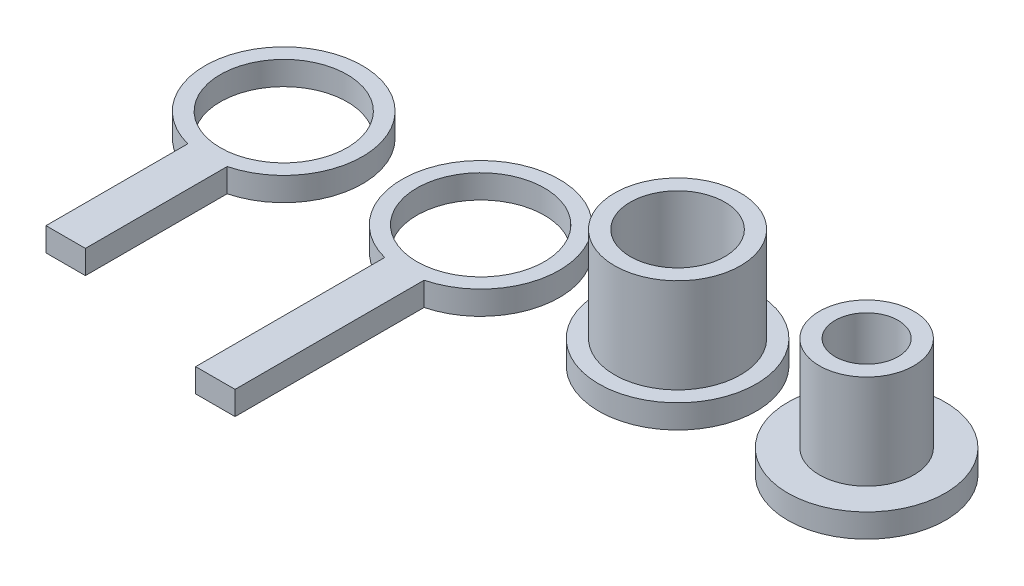
ISO-10303-21;
HEADER;
FILE_DESCRIPTION(('STEP AP214'),'2;1');
FILE_NAME('part.step','',(''),(''),'','','');
FILE_SCHEMA(('AUTOMOTIVE_DESIGN { 1 0 10303 214 1 1 1 1 }'));
ENDSEC;
DATA;
#1=APPLICATION_CONTEXT('core data for automotive mechanical design processes');
#2=APPLICATION_PROTOCOL_DEFINITION('international standard','automotive_design',2000,#1);
#3=PRODUCT_CONTEXT('',#1,'mechanical');
#4=PRODUCT('Part','Part','',(#3));
#5=PRODUCT_RELATED_PRODUCT_CATEGORY('part','',(#4));
#6=PRODUCT_DEFINITION_FORMATION('','',#4);
#7=PRODUCT_DEFINITION_CONTEXT('part definition',#1,'design');
#8=PRODUCT_DEFINITION('design','',#6,#7);
#9=PRODUCT_DEFINITION_SHAPE('','',#8);
#10=(LENGTH_UNIT() NAMED_UNIT(*) SI_UNIT(.MILLI.,.METRE.));
#11=(NAMED_UNIT(*) PLANE_ANGLE_UNIT() SI_UNIT($,.RADIAN.));
#12=(NAMED_UNIT(*) SI_UNIT($,.STERADIAN.) SOLID_ANGLE_UNIT());
#13=UNCERTAINTY_MEASURE_WITH_UNIT(LENGTH_MEASURE(1.E-05),#10,'distance_accuracy_value','');
#14=(GEOMETRIC_REPRESENTATION_CONTEXT(3) GLOBAL_UNCERTAINTY_ASSIGNED_CONTEXT((#13)) GLOBAL_UNIT_ASSIGNED_CONTEXT((#10,
#11,#12)) REPRESENTATION_CONTEXT('',''));
#15=CARTESIAN_POINT('',(0.,0.,0.));
#16=DIRECTION('',(0.,0.,1.));
#17=DIRECTION('',(1.,0.,0.));
#18=AXIS2_PLACEMENT_3D('',#15,#16,#17);
#19=CARTESIAN_POINT('',(-50.,3.,0.));
#20=DIRECTION('',(0.,1.,0.));
#21=DIRECTION('',(0.,0.,1.));
#22=AXIS2_PLACEMENT_3D('',#19,#20,#21);
#23=PLANE('',#22);
#24=CARTESIAN_POINT('',(-50.,3.,0.));
#25=DIRECTION('',(0.,1.,0.));
#26=DIRECTION('',(0.,0.,1.));
#27=AXIS2_PLACEMENT_3D('',#24,#25,#26);
#28=CIRCLE('',#27,10.);
#29=CARTESIAN_POINT('',(-47.5,3.,9.68245836551855));
#30=VERTEX_POINT('',#29);
#31=CARTESIAN_POINT('',(-52.5,3.,9.68245836551855));
#32=VERTEX_POINT('',#31);
#33=EDGE_CURVE('E116',#30,#32,#28,.T.);
#34=ORIENTED_EDGE('',*,*,#33,.T.);
#35=DIRECTION('',(0.,0.,1.));
#36=VECTOR('',#35,1.);
#37=CARTESIAN_POINT('',(-52.5,3.,27.6824583655185));
#38=LINE('',#37,#36);
#39=CARTESIAN_POINT('',(-52.5,3.,27.6824583655185));
#40=VERTEX_POINT('',#39);
#41=EDGE_CURVE('E85',#32,#40,#38,.T.);
#42=ORIENTED_EDGE('',*,*,#41,.T.);
#43=DIRECTION('',(1.,0.,0.));
#44=VECTOR('',#43,1.);
#45=CARTESIAN_POINT('',(-52.5,3.,27.6824583655185));
#46=LINE('',#45,#44);
#47=CARTESIAN_POINT('',(-47.5,3.,27.6824583655185));
#48=VERTEX_POINT('',#47);
#49=EDGE_CURVE('E124',#40,#48,#46,.T.);
#50=ORIENTED_EDGE('',*,*,#49,.T.);
#51=DIRECTION('',(0.,0.,-1.));
#52=VECTOR('',#51,1.);
#53=CARTESIAN_POINT('',(-47.5,3.,27.6824583655185));
#54=LINE('',#53,#52);
#55=EDGE_CURVE('E109',#48,#30,#54,.T.);
#56=ORIENTED_EDGE('',*,*,#55,.T.);
#57=EDGE_LOOP('',(#34,#42,#50,#56));
#58=FACE_BOUND('',#57,.T.);
#59=CARTESIAN_POINT('',(-50.,3.,0.));
#60=DIRECTION('',(0.,1.,0.));
#61=DIRECTION('',(0.,0.,1.));
#62=AXIS2_PLACEMENT_3D('',#59,#60,#61);
#63=CIRCLE('',#62,8.05);
#64=CARTESIAN_POINT('',(-50.,3.,8.05));
#65=VERTEX_POINT('',#64);
#66=EDGE_CURVE('E56',#65,#65,#63,.T.);
#67=ORIENTED_EDGE('',*,*,#66,.F.);
#68=EDGE_LOOP('',(#67));
#69=FACE_BOUND('',#68,.T.);
#70=ADVANCED_FACE('F52',(#58,#69),#23,.T.);
#71=CARTESIAN_POINT('',(-50.,0.,0.));
#72=DIRECTION('',(0.,1.,0.));
#73=DIRECTION('',(0.,0.,1.));
#74=AXIS2_PLACEMENT_3D('',#71,#72,#73);
#75=PLANE('',#74);
#76=CARTESIAN_POINT('',(-50.,0.,0.));
#77=DIRECTION('',(0.,1.,0.));
#78=DIRECTION('',(0.,0.,1.));
#79=AXIS2_PLACEMENT_3D('',#76,#77,#78);
#80=CIRCLE('',#79,10.);
#81=CARTESIAN_POINT('',(-47.5,0.,9.68245836551855));
#82=VERTEX_POINT('',#81);
#83=CARTESIAN_POINT('',(-52.5,0.,9.68245836551855));
#84=VERTEX_POINT('',#83);
#85=EDGE_CURVE('E115',#82,#84,#80,.T.);
#86=ORIENTED_EDGE('',*,*,#85,.F.);
#87=DIRECTION('',(0.,0.,-1.));
#88=VECTOR('',#87,1.);
#89=CARTESIAN_POINT('',(-47.5,0.,27.6824583655185));
#90=LINE('',#89,#88);
#91=CARTESIAN_POINT('',(-47.5,0.,27.6824583655185));
#92=VERTEX_POINT('',#91);
#93=EDGE_CURVE('E95',#92,#82,#90,.T.);
#94=ORIENTED_EDGE('',*,*,#93,.F.);
#95=DIRECTION('',(1.,0.,0.));
#96=VECTOR('',#95,1.);
#97=CARTESIAN_POINT('',(-52.5,0.,27.6824583655185));
#98=LINE('',#97,#96);
#99=CARTESIAN_POINT('',(-52.5,0.,27.6824583655185));
#100=VERTEX_POINT('',#99);
#101=EDGE_CURVE('E101',#100,#92,#98,.T.);
#102=ORIENTED_EDGE('',*,*,#101,.F.);
#103=DIRECTION('',(0.,0.,1.));
#104=VECTOR('',#103,1.);
#105=CARTESIAN_POINT('',(-52.5,0.,27.6824583655185));
#106=LINE('',#105,#104);
#107=EDGE_CURVE('E69',#84,#100,#106,.T.);
#108=ORIENTED_EDGE('',*,*,#107,.F.);
#109=EDGE_LOOP('',(#86,#94,#102,#108));
#110=FACE_BOUND('',#109,.T.);
#111=CARTESIAN_POINT('',(-50.,0.,0.));
#112=DIRECTION('',(0.,1.,0.));
#113=DIRECTION('',(0.,0.,1.));
#114=AXIS2_PLACEMENT_3D('',#111,#112,#113);
#115=CIRCLE('',#114,8.05);
#116=CARTESIAN_POINT('',(-50.,0.,8.05));
#117=VERTEX_POINT('',#116);
#118=EDGE_CURVE('E12',#117,#117,#115,.T.);
#119=ORIENTED_EDGE('',*,*,#118,.T.);
#120=EDGE_LOOP('',(#119));
#121=FACE_BOUND('',#120,.T.);
#122=ADVANCED_FACE('F112',(#110,#121),#75,.F.);
#123=CARTESIAN_POINT('',(-50.,3.,0.));
#124=DIRECTION('',(0.,-1.,0.));
#125=DIRECTION('',(0.,0.,-1.));
#126=AXIS2_PLACEMENT_3D('',#123,#124,#125);
#127=CYLINDRICAL_SURFACE('',#126,10.);
#128=ORIENTED_EDGE('',*,*,#85,.T.);
#129=DIRECTION('',(0.,-1.,0.));
#130=VECTOR('',#129,1.);
#131=CARTESIAN_POINT('',(-52.5,3.,9.68245836551855));
#132=LINE('',#131,#130);
#133=EDGE_CURVE('E131',#32,#84,#132,.T.);
#134=ORIENTED_EDGE('',*,*,#133,.F.);
#135=ORIENTED_EDGE('',*,*,#33,.F.);
#136=DIRECTION('',(0.,-1.,0.));
#137=VECTOR('',#136,1.);
#138=CARTESIAN_POINT('',(-47.5,3.,9.68245836551855));
#139=LINE('',#138,#137);
#140=EDGE_CURVE('E110',#30,#82,#139,.T.);
#141=ORIENTED_EDGE('',*,*,#140,.T.);
#142=EDGE_LOOP('',(#128,#134,#135,#141));
#143=FACE_BOUND('',#142,.T.);
#144=ADVANCED_FACE('F130',(#143),#127,.T.);
#145=CARTESIAN_POINT('',(-52.5,3.,27.6824583655185));
#146=DIRECTION('',(1.,0.,0.));
#147=DIRECTION('',(0.,0.,-1.));
#148=AXIS2_PLACEMENT_3D('',#145,#146,#147);
#149=PLANE('',#148);
#150=ORIENTED_EDGE('',*,*,#107,.T.);
#151=DIRECTION('',(0.,-1.,0.));
#152=VECTOR('',#151,1.);
#153=CARTESIAN_POINT('',(-52.5,3.,27.6824583655185));
#154=LINE('',#153,#152);
#155=EDGE_CURVE('E106',#40,#100,#154,.T.);
#156=ORIENTED_EDGE('',*,*,#155,.F.);
#157=ORIENTED_EDGE('',*,*,#41,.F.);
#158=ORIENTED_EDGE('',*,*,#133,.T.);
#159=EDGE_LOOP('',(#150,#156,#157,#158));
#160=FACE_BOUND('',#159,.T.);
#161=ADVANCED_FACE('F134',(#160),#149,.F.);
#162=CARTESIAN_POINT('',(-52.5,3.,27.6824583655185));
#163=DIRECTION('',(0.,0.,-1.));
#164=DIRECTION('',(-1.,0.,0.));
#165=AXIS2_PLACEMENT_3D('',#162,#163,#164);
#166=PLANE('',#165);
#167=ORIENTED_EDGE('',*,*,#101,.T.);
#168=DIRECTION('',(0.,-1.,0.));
#169=VECTOR('',#168,1.);
#170=CARTESIAN_POINT('',(-47.5,3.,27.6824583655185));
#171=LINE('',#170,#169);
#172=EDGE_CURVE('E104',#48,#92,#171,.T.);
#173=ORIENTED_EDGE('',*,*,#172,.F.);
#174=ORIENTED_EDGE('',*,*,#49,.F.);
#175=ORIENTED_EDGE('',*,*,#155,.T.);
#176=EDGE_LOOP('',(#167,#173,#174,#175));
#177=FACE_BOUND('',#176,.T.);
#178=ADVANCED_FACE('F102',(#177),#166,.F.);
#179=CARTESIAN_POINT('',(-47.5,3.,27.6824583655185));
#180=DIRECTION('',(-1.,0.,0.));
#181=DIRECTION('',(0.,0.,1.));
#182=AXIS2_PLACEMENT_3D('',#179,#180,#181);
#183=PLANE('',#182);
#184=ORIENTED_EDGE('',*,*,#93,.T.);
#185=ORIENTED_EDGE('',*,*,#140,.F.);
#186=ORIENTED_EDGE('',*,*,#55,.F.);
#187=ORIENTED_EDGE('',*,*,#172,.T.);
#188=EDGE_LOOP('',(#184,#185,#186,#187));
#189=FACE_BOUND('',#188,.T.);
#190=ADVANCED_FACE('F108',(#189),#183,.F.);
#191=CARTESIAN_POINT('',(-50.,3.,0.));
#192=DIRECTION('',(0.,-1.,0.));
#193=DIRECTION('',(0.,0.,-1.));
#194=AXIS2_PLACEMENT_3D('',#191,#192,#193);
#195=CYLINDRICAL_SURFACE('',#194,8.05);
#196=ORIENTED_EDGE('',*,*,#66,.T.);
#197=EDGE_LOOP('',(#196));
#198=FACE_BOUND('',#197,.T.);
#199=ORIENTED_EDGE('',*,*,#118,.F.);
#200=EDGE_LOOP('',(#199));
#201=FACE_BOUND('',#200,.T.);
#202=ADVANCED_FACE('F54',(#198,#201),#195,.F.);
#203=CLOSED_SHELL('',(#70,#122,#144,#161,#178,#190,#202));
#204=MANIFOLD_SOLID_BREP('B2',#203);
#205=CARTESIAN_POINT('',(-25.,3.,0.));
#206=DIRECTION('',(0.,1.,0.));
#207=DIRECTION('',(0.,0.,1.));
#208=AXIS2_PLACEMENT_3D('',#205,#206,#207);
#209=PLANE('',#208);
#210=CARTESIAN_POINT('',(-25.,3.,0.));
#211=DIRECTION('',(0.,1.,0.));
#212=DIRECTION('',(0.,0.,1.));
#213=AXIS2_PLACEMENT_3D('',#210,#211,#212);
#214=CIRCLE('',#213,10.);
#215=CARTESIAN_POINT('',(-22.5,3.,9.68245836551854));
#216=VERTEX_POINT('',#215);
#217=CARTESIAN_POINT('',(-27.5,3.,9.68245836551854));
#218=VERTEX_POINT('',#217);
#219=EDGE_CURVE('E257',#216,#218,#214,.T.);
#220=ORIENTED_EDGE('',*,*,#219,.T.);
#221=DIRECTION('',(0.,0.,1.));
#222=VECTOR('',#221,1.);
#223=CARTESIAN_POINT('',(-27.5,3.,33.6824583655185));
#224=LINE('',#223,#222);
#225=CARTESIAN_POINT('',(-27.5,3.,33.6824583655185));
#226=VERTEX_POINT('',#225);
#227=EDGE_CURVE('E252',#218,#226,#224,.T.);
#228=ORIENTED_EDGE('',*,*,#227,.T.);
#229=DIRECTION('',(1.,0.,0.));
#230=VECTOR('',#229,1.);
#231=CARTESIAN_POINT('',(-27.5,3.,33.6824583655185));
#232=LINE('',#231,#230);
#233=CARTESIAN_POINT('',(-22.5,3.,33.6824583655185));
#234=VERTEX_POINT('',#233);
#235=EDGE_CURVE('E255',#226,#234,#232,.T.);
#236=ORIENTED_EDGE('',*,*,#235,.T.);
#237=DIRECTION('',(0.,0.,-1.));
#238=VECTOR('',#237,1.);
#239=CARTESIAN_POINT('',(-22.5,3.,33.6824583655185));
#240=LINE('',#239,#238);
#241=EDGE_CURVE('E222',#234,#216,#240,.T.);
#242=ORIENTED_EDGE('',*,*,#241,.T.);
#243=EDGE_LOOP('',(#220,#228,#236,#242));
#244=FACE_BOUND('',#243,.T.);
#245=CARTESIAN_POINT('',(-25.,3.,0.));
#246=DIRECTION('',(0.,1.,0.));
#247=DIRECTION('',(0.,0.,1.));
#248=AXIS2_PLACEMENT_3D('',#245,#246,#247);
#249=CIRCLE('',#248,8.1);
#250=CARTESIAN_POINT('',(-25.,3.,8.1));
#251=VERTEX_POINT('',#250);
#252=EDGE_CURVE('E272',#251,#251,#249,.T.);
#253=ORIENTED_EDGE('',*,*,#252,.F.);
#254=EDGE_LOOP('',(#253));
#255=FACE_BOUND('',#254,.T.);
#256=ADVANCED_FACE('F205',(#244,#255),#209,.T.);
#257=CARTESIAN_POINT('',(-25.,0.,0.));
#258=DIRECTION('',(0.,1.,0.));
#259=DIRECTION('',(0.,0.,1.));
#260=AXIS2_PLACEMENT_3D('',#257,#258,#259);
#261=PLANE('',#260);
#262=CARTESIAN_POINT('',(-25.,0.,0.));
#263=DIRECTION('',(0.,1.,0.));
#264=DIRECTION('',(0.,0.,1.));
#265=AXIS2_PLACEMENT_3D('',#262,#263,#264);
#266=CIRCLE('',#265,10.);
#267=CARTESIAN_POINT('',(-22.5,0.,9.68245836551854));
#268=VERTEX_POINT('',#267);
#269=CARTESIAN_POINT('',(-27.5,0.,9.68245836551854));
#270=VERTEX_POINT('',#269);
#271=EDGE_CURVE('E269',#268,#270,#266,.T.);
#272=ORIENTED_EDGE('',*,*,#271,.F.);
#273=DIRECTION('',(0.,0.,-1.));
#274=VECTOR('',#273,1.);
#275=CARTESIAN_POINT('',(-22.5,0.,33.6824583655185));
#276=LINE('',#275,#274);
#277=CARTESIAN_POINT('',(-22.5,0.,33.6824583655185));
#278=VERTEX_POINT('',#277);
#279=EDGE_CURVE('E245',#278,#268,#276,.T.);
#280=ORIENTED_EDGE('',*,*,#279,.F.);
#281=DIRECTION('',(1.,0.,0.));
#282=VECTOR('',#281,1.);
#283=CARTESIAN_POINT('',(-27.5,0.,33.6824583655185));
#284=LINE('',#283,#282);
#285=CARTESIAN_POINT('',(-27.5,0.,33.6824583655185));
#286=VERTEX_POINT('',#285);
#287=EDGE_CURVE('E239',#286,#278,#284,.T.);
#288=ORIENTED_EDGE('',*,*,#287,.F.);
#289=DIRECTION('',(0.,0.,1.));
#290=VECTOR('',#289,1.);
#291=CARTESIAN_POINT('',(-27.5,0.,33.6824583655185));
#292=LINE('',#291,#290);
#293=EDGE_CURVE('E261',#270,#286,#292,.T.);
#294=ORIENTED_EDGE('',*,*,#293,.F.);
#295=EDGE_LOOP('',(#272,#280,#288,#294));
#296=FACE_BOUND('',#295,.T.);
#297=CARTESIAN_POINT('',(-25.,0.,0.));
#298=DIRECTION('',(0.,1.,0.));
#299=DIRECTION('',(0.,0.,1.));
#300=AXIS2_PLACEMENT_3D('',#297,#298,#299);
#301=CIRCLE('',#300,8.1);
#302=CARTESIAN_POINT('',(-25.,0.,8.1));
#303=VERTEX_POINT('',#302);
#304=EDGE_CURVE('E284',#303,#303,#301,.T.);
#305=ORIENTED_EDGE('',*,*,#304,.T.);
#306=EDGE_LOOP('',(#305));
#307=FACE_BOUND('',#306,.T.);
#308=ADVANCED_FACE('F280',(#296,#307),#261,.F.);
#309=CARTESIAN_POINT('',(-25.,3.,0.));
#310=DIRECTION('',(0.,-1.,0.));
#311=DIRECTION('',(0.,0.,-1.));
#312=AXIS2_PLACEMENT_3D('',#309,#310,#311);
#313=CYLINDRICAL_SURFACE('',#312,10.);
#314=ORIENTED_EDGE('',*,*,#271,.T.);
#315=DIRECTION('',(0.,-1.,0.));
#316=VECTOR('',#315,1.);
#317=CARTESIAN_POINT('',(-27.5,3.,9.68245836551854));
#318=LINE('',#317,#316);
#319=EDGE_CURVE('E50',#218,#270,#318,.T.);
#320=ORIENTED_EDGE('',*,*,#319,.F.);
#321=ORIENTED_EDGE('',*,*,#219,.F.);
#322=DIRECTION('',(0.,-1.,0.));
#323=VECTOR('',#322,1.);
#324=CARTESIAN_POINT('',(-22.5,3.,9.68245836551854));
#325=LINE('',#324,#323);
#326=EDGE_CURVE('E265',#216,#268,#325,.T.);
#327=ORIENTED_EDGE('',*,*,#326,.T.);
#328=EDGE_LOOP('',(#314,#320,#321,#327));
#329=FACE_BOUND('',#328,.T.);
#330=ADVANCED_FACE('F207',(#329),#313,.T.);
#331=CARTESIAN_POINT('',(-27.5,3.,33.6824583655185));
#332=DIRECTION('',(1.,0.,0.));
#333=DIRECTION('',(0.,0.,-1.));
#334=AXIS2_PLACEMENT_3D('',#331,#332,#333);
#335=PLANE('',#334);
#336=ORIENTED_EDGE('',*,*,#293,.T.);
#337=DIRECTION('',(0.,-1.,0.));
#338=VECTOR('',#337,1.);
#339=CARTESIAN_POINT('',(-27.5,3.,33.6824583655185));
#340=LINE('',#339,#338);
#341=EDGE_CURVE('E214',#226,#286,#340,.T.);
#342=ORIENTED_EDGE('',*,*,#341,.F.);
#343=ORIENTED_EDGE('',*,*,#227,.F.);
#344=ORIENTED_EDGE('',*,*,#319,.T.);
#345=EDGE_LOOP('',(#336,#342,#343,#344));
#346=FACE_BOUND('',#345,.T.);
#347=ADVANCED_FACE('F260',(#346),#335,.F.);
#348=CARTESIAN_POINT('',(-27.5,3.,33.6824583655185));
#349=DIRECTION('',(0.,0.,-1.));
#350=DIRECTION('',(-1.,0.,0.));
#351=AXIS2_PLACEMENT_3D('',#348,#349,#350);
#352=PLANE('',#351);
#353=ORIENTED_EDGE('',*,*,#287,.T.);
#354=DIRECTION('',(0.,-1.,0.));
#355=VECTOR('',#354,1.);
#356=CARTESIAN_POINT('',(-22.5,3.,33.6824583655185));
#357=LINE('',#356,#355);
#358=EDGE_CURVE('E262',#234,#278,#357,.T.);
#359=ORIENTED_EDGE('',*,*,#358,.F.);
#360=ORIENTED_EDGE('',*,*,#235,.F.);
#361=ORIENTED_EDGE('',*,*,#341,.T.);
#362=EDGE_LOOP('',(#353,#359,#360,#361));
#363=FACE_BOUND('',#362,.T.);
#364=ADVANCED_FACE('F263',(#363),#352,.F.);
#365=CARTESIAN_POINT('',(-22.5,3.,33.6824583655185));
#366=DIRECTION('',(-1.,0.,0.));
#367=DIRECTION('',(0.,0.,1.));
#368=AXIS2_PLACEMENT_3D('',#365,#366,#367);
#369=PLANE('',#368);
#370=ORIENTED_EDGE('',*,*,#279,.T.);
#371=ORIENTED_EDGE('',*,*,#326,.F.);
#372=ORIENTED_EDGE('',*,*,#241,.F.);
#373=ORIENTED_EDGE('',*,*,#358,.T.);
#374=EDGE_LOOP('',(#370,#371,#372,#373));
#375=FACE_BOUND('',#374,.T.);
#376=ADVANCED_FACE('F277',(#375),#369,.F.);
#377=CARTESIAN_POINT('',(-25.,3.,0.));
#378=DIRECTION('',(0.,-1.,0.));
#379=DIRECTION('',(0.,0.,-1.));
#380=AXIS2_PLACEMENT_3D('',#377,#378,#379);
#381=CYLINDRICAL_SURFACE('',#380,8.1);
#382=ORIENTED_EDGE('',*,*,#252,.T.);
#383=EDGE_LOOP('',(#382));
#384=FACE_BOUND('',#383,.T.);
#385=ORIENTED_EDGE('',*,*,#304,.F.);
#386=EDGE_LOOP('',(#385));
#387=FACE_BOUND('',#386,.T.);
#388=ADVANCED_FACE('F290',(#384,#387),#381,.F.);
#389=CLOSED_SHELL('',(#256,#308,#330,#347,#364,#376,#388));
#390=MANIFOLD_SOLID_BREP('B6',#389);
#391=CARTESIAN_POINT('',(24.,3.,0.));
#392=DIRECTION('',(0.,-1.,0.));
#393=DIRECTION('',(0.,0.,-1.));
#394=AXIS2_PLACEMENT_3D('',#391,#392,#393);
#395=CYLINDRICAL_SURFACE('',#394,10.);
#396=CARTESIAN_POINT('',(24.,3.,0.));
#397=DIRECTION('',(0.,1.,0.));
#398=DIRECTION('',(0.,0.,1.));
#399=AXIS2_PLACEMENT_3D('',#396,#397,#398);
#400=CIRCLE('',#399,10.);
#401=CARTESIAN_POINT('',(24.,3.,10.));
#402=VERTEX_POINT('',#401);
#403=EDGE_CURVE('E361',#402,#402,#400,.T.);
#404=ORIENTED_EDGE('',*,*,#403,.F.);
#405=EDGE_LOOP('',(#404));
#406=FACE_BOUND('',#405,.T.);
#407=CARTESIAN_POINT('',(24.,0.,0.));
#408=DIRECTION('',(0.,1.,0.));
#409=DIRECTION('',(0.,0.,1.));
#410=AXIS2_PLACEMENT_3D('',#407,#408,#409);
#411=CIRCLE('',#410,10.);
#412=CARTESIAN_POINT('',(24.,0.,10.));
#413=VERTEX_POINT('',#412);
#414=EDGE_CURVE('E365',#413,#413,#411,.T.);
#415=ORIENTED_EDGE('',*,*,#414,.T.);
#416=EDGE_LOOP('',(#415));
#417=FACE_BOUND('',#416,.T.);
#418=ADVANCED_FACE('F357',(#406,#417),#395,.T.);
#419=CARTESIAN_POINT('',(24.,3.,0.));
#420=DIRECTION('',(0.,1.,0.));
#421=DIRECTION('',(0.,0.,1.));
#422=AXIS2_PLACEMENT_3D('',#419,#420,#421);
#423=PLANE('',#422);
#424=CARTESIAN_POINT('',(24.,3.,0.));
#425=DIRECTION('',(0.,1.,0.));
#426=DIRECTION('',(0.,0.,1.));
#427=AXIS2_PLACEMENT_3D('',#424,#425,#426);
#428=CIRCLE('',#427,6.);
#429=CARTESIAN_POINT('',(24.,3.,6.));
#430=VERTEX_POINT('',#429);
#431=EDGE_CURVE('E204',#430,#430,#428,.T.);
#432=ORIENTED_EDGE('',*,*,#431,.F.);
#433=EDGE_LOOP('',(#432));
#434=FACE_BOUND('',#433,.T.);
#435=ORIENTED_EDGE('',*,*,#403,.T.);
#436=EDGE_LOOP('',(#435));
#437=FACE_BOUND('',#436,.T.);
#438=ADVANCED_FACE('F359',(#434,#437),#423,.T.);
#439=CARTESIAN_POINT('',(24.,0.,0.));
#440=DIRECTION('',(0.,1.,0.));
#441=DIRECTION('',(0.,0.,1.));
#442=AXIS2_PLACEMENT_3D('',#439,#440,#441);
#443=PLANE('',#442);
#444=CARTESIAN_POINT('',(24.,0.,0.));
#445=DIRECTION('',(0.,1.,0.));
#446=DIRECTION('',(0.,0.,1.));
#447=AXIS2_PLACEMENT_3D('',#444,#445,#446);
#448=CIRCLE('',#447,4.);
#449=CARTESIAN_POINT('',(24.,0.,4.));
#450=VERTEX_POINT('',#449);
#451=EDGE_CURVE('E374',#450,#450,#448,.T.);
#452=ORIENTED_EDGE('',*,*,#451,.T.);
#453=EDGE_LOOP('',(#452));
#454=FACE_BOUND('',#453,.T.);
#455=ORIENTED_EDGE('',*,*,#414,.F.);
#456=EDGE_LOOP('',(#455));
#457=FACE_BOUND('',#456,.T.);
#458=ADVANCED_FACE('F381',(#454,#457),#443,.F.);
#459=CARTESIAN_POINT('',(24.,15.,0.));
#460=DIRECTION('',(0.,-1.,0.));
#461=DIRECTION('',(0.,0.,-1.));
#462=AXIS2_PLACEMENT_3D('',#459,#460,#461);
#463=CYLINDRICAL_SURFACE('',#462,6.);
#464=CARTESIAN_POINT('',(24.,15.,0.));
#465=DIRECTION('',(0.,1.,0.));
#466=DIRECTION('',(0.,0.,1.));
#467=AXIS2_PLACEMENT_3D('',#464,#465,#466);
#468=CIRCLE('',#467,6.);
#469=CARTESIAN_POINT('',(24.,15.,6.));
#470=VERTEX_POINT('',#469);
#471=EDGE_CURVE('E371',#470,#470,#468,.T.);
#472=ORIENTED_EDGE('',*,*,#471,.F.);
#473=EDGE_LOOP('',(#472));
#474=FACE_BOUND('',#473,.T.);
#475=ORIENTED_EDGE('',*,*,#431,.T.);
#476=EDGE_LOOP('',(#475));
#477=FACE_BOUND('',#476,.T.);
#478=ADVANCED_FACE('F393',(#474,#477),#463,.T.);
#479=CARTESIAN_POINT('',(24.,15.,0.));
#480=DIRECTION('',(0.,1.,0.));
#481=DIRECTION('',(0.,0.,1.));
#482=AXIS2_PLACEMENT_3D('',#479,#480,#481);
#483=PLANE('',#482);
#484=CARTESIAN_POINT('',(24.,15.,0.));
#485=DIRECTION('',(0.,1.,0.));
#486=DIRECTION('',(0.,0.,1.));
#487=AXIS2_PLACEMENT_3D('',#484,#485,#486);
#488=CIRCLE('',#487,4.);
#489=CARTESIAN_POINT('',(24.,15.,4.));
#490=VERTEX_POINT('',#489);
#491=EDGE_CURVE('E375',#490,#490,#488,.T.);
#492=ORIENTED_EDGE('',*,*,#491,.F.);
#493=EDGE_LOOP('',(#492));
#494=FACE_BOUND('',#493,.T.);
#495=ORIENTED_EDGE('',*,*,#471,.T.);
#496=EDGE_LOOP('',(#495));
#497=FACE_BOUND('',#496,.T.);
#498=ADVANCED_FACE('F387',(#494,#497),#483,.T.);
#499=CARTESIAN_POINT('',(24.,0.,0.));
#500=DIRECTION('',(0.,1.,0.));
#501=DIRECTION('',(0.,0.,1.));
#502=AXIS2_PLACEMENT_3D('',#499,#500,#501);
#503=CYLINDRICAL_SURFACE('',#502,4.);
#504=ORIENTED_EDGE('',*,*,#451,.F.);
#505=EDGE_LOOP('',(#504));
#506=FACE_BOUND('',#505,.T.);
#507=ORIENTED_EDGE('',*,*,#491,.T.);
#508=EDGE_LOOP('',(#507));
#509=FACE_BOUND('',#508,.T.);
#510=ADVANCED_FACE('F384',(#506,#509),#503,.F.);
#511=CLOSED_SHELL('',(#418,#438,#458,#478,#498,#510));
#512=MANIFOLD_SOLID_BREP('B44',#511);
#513=CARTESIAN_POINT('',(0.,3.,0.));
#514=DIRECTION('',(0.,-1.,0.));
#515=DIRECTION('',(0.,0.,-1.));
#516=AXIS2_PLACEMENT_3D('',#513,#514,#515);
#517=CYLINDRICAL_SURFACE('',#516,10.);
#518=CARTESIAN_POINT('',(0.,3.,0.));
#519=DIRECTION('',(0.,1.,0.));
#520=DIRECTION('',(0.,0.,1.));
#521=AXIS2_PLACEMENT_3D('',#518,#519,#520);
#522=CIRCLE('',#521,10.);
#523=CARTESIAN_POINT('',(0.,3.,10.));
#524=VERTEX_POINT('',#523);
#525=EDGE_CURVE('E456',#524,#524,#522,.T.);
#526=ORIENTED_EDGE('',*,*,#525,.F.);
#527=EDGE_LOOP('',(#526));
#528=FACE_BOUND('',#527,.T.);
#529=CARTESIAN_POINT('',(0.,0.,0.));
#530=DIRECTION('',(0.,1.,0.));
#531=DIRECTION('',(0.,0.,1.));
#532=AXIS2_PLACEMENT_3D('',#529,#530,#531);
#533=CIRCLE('',#532,10.);
#534=CARTESIAN_POINT('',(0.,0.,10.));
#535=VERTEX_POINT('',#534);
#536=EDGE_CURVE('E452',#535,#535,#533,.T.);
#537=ORIENTED_EDGE('',*,*,#536,.T.);
#538=EDGE_LOOP('',(#537));
#539=FACE_BOUND('',#538,.T.);
#540=ADVANCED_FACE('F449',(#528,#539),#517,.T.);
#541=CARTESIAN_POINT('',(0.,3.,0.));
#542=DIRECTION('',(0.,1.,0.));
#543=DIRECTION('',(0.,0.,1.));
#544=AXIS2_PLACEMENT_3D('',#541,#542,#543);
#545=PLANE('',#544);
#546=CARTESIAN_POINT('',(0.,3.,0.));
#547=DIRECTION('',(0.,1.,0.));
#548=DIRECTION('',(0.,0.,1.));
#549=AXIS2_PLACEMENT_3D('',#546,#547,#548);
#550=CIRCLE('',#549,8.);
#551=CARTESIAN_POINT('',(0.,3.,8.));
#552=VERTEX_POINT('',#551);
#553=EDGE_CURVE('E356',#552,#552,#550,.T.);
#554=ORIENTED_EDGE('',*,*,#553,.F.);
#555=EDGE_LOOP('',(#554));
#556=FACE_BOUND('',#555,.T.);
#557=ORIENTED_EDGE('',*,*,#525,.T.);
#558=EDGE_LOOP('',(#557));
#559=FACE_BOUND('',#558,.T.);
#560=ADVANCED_FACE('F494',(#556,#559),#545,.T.);
#561=CARTESIAN_POINT('',(0.,0.,0.));
#562=DIRECTION('',(0.,1.,0.));
#563=DIRECTION('',(0.,0.,1.));
#564=AXIS2_PLACEMENT_3D('',#561,#562,#563);
#565=PLANE('',#564);
#566=CARTESIAN_POINT('',(0.,0.,0.));
#567=DIRECTION('',(0.,1.,0.));
#568=DIRECTION('',(0.,0.,1.));
#569=AXIS2_PLACEMENT_3D('',#566,#567,#568);
#570=CIRCLE('',#569,6.);
#571=CARTESIAN_POINT('',(0.,0.,6.));
#572=VERTEX_POINT('',#571);
#573=EDGE_CURVE('E465',#572,#572,#570,.T.);
#574=ORIENTED_EDGE('',*,*,#573,.T.);
#575=EDGE_LOOP('',(#574));
#576=FACE_BOUND('',#575,.T.);
#577=ORIENTED_EDGE('',*,*,#536,.F.);
#578=EDGE_LOOP('',(#577));
#579=FACE_BOUND('',#578,.T.);
#580=ADVANCED_FACE('F472',(#576,#579),#565,.F.);
#581=CARTESIAN_POINT('',(0.,15.,0.));
#582=DIRECTION('',(0.,-1.,0.));
#583=DIRECTION('',(0.,0.,-1.));
#584=AXIS2_PLACEMENT_3D('',#581,#582,#583);
#585=CYLINDRICAL_SURFACE('',#584,8.);
#586=CARTESIAN_POINT('',(0.,15.,0.));
#587=DIRECTION('',(0.,1.,0.));
#588=DIRECTION('',(0.,0.,1.));
#589=AXIS2_PLACEMENT_3D('',#586,#587,#588);
#590=CIRCLE('',#589,8.);
#591=CARTESIAN_POINT('',(0.,15.,8.));
#592=VERTEX_POINT('',#591);
#593=EDGE_CURVE('E462',#592,#592,#590,.T.);
#594=ORIENTED_EDGE('',*,*,#593,.F.);
#595=EDGE_LOOP('',(#594));
#596=FACE_BOUND('',#595,.T.);
#597=ORIENTED_EDGE('',*,*,#553,.T.);
#598=EDGE_LOOP('',(#597));
#599=FACE_BOUND('',#598,.T.);
#600=ADVANCED_FACE('F484',(#596,#599),#585,.T.);
#601=CARTESIAN_POINT('',(0.,15.,0.));
#602=DIRECTION('',(0.,1.,0.));
#603=DIRECTION('',(0.,0.,1.));
#604=AXIS2_PLACEMENT_3D('',#601,#602,#603);
#605=PLANE('',#604);
#606=CARTESIAN_POINT('',(0.,15.,0.));
#607=DIRECTION('',(0.,1.,0.));
#608=DIRECTION('',(0.,0.,1.));
#609=AXIS2_PLACEMENT_3D('',#606,#607,#608);
#610=CIRCLE('',#609,6.);
#611=CARTESIAN_POINT('',(0.,15.,6.));
#612=VERTEX_POINT('',#611);
#613=EDGE_CURVE('E466',#612,#612,#610,.T.);
#614=ORIENTED_EDGE('',*,*,#613,.F.);
#615=EDGE_LOOP('',(#614));
#616=FACE_BOUND('',#615,.T.);
#617=ORIENTED_EDGE('',*,*,#593,.T.);
#618=EDGE_LOOP('',(#617));
#619=FACE_BOUND('',#618,.T.);
#620=ADVANCED_FACE('F478',(#616,#619),#605,.T.);
#621=CARTESIAN_POINT('',(0.,0.,0.));
#622=DIRECTION('',(0.,1.,0.));
#623=DIRECTION('',(0.,0.,1.));
#624=AXIS2_PLACEMENT_3D('',#621,#622,#623);
#625=CYLINDRICAL_SURFACE('',#624,6.);
#626=ORIENTED_EDGE('',*,*,#573,.F.);
#627=EDGE_LOOP('',(#626));
#628=FACE_BOUND('',#627,.T.);
#629=ORIENTED_EDGE('',*,*,#613,.T.);
#630=EDGE_LOOP('',(#629));
#631=FACE_BOUND('',#630,.T.);
#632=ADVANCED_FACE('F475',(#628,#631),#625,.F.);
#633=CLOSED_SHELL('',(#540,#560,#580,#600,#620,#632));
#634=MANIFOLD_SOLID_BREP('B199',#633);
#635=ADVANCED_BREP_SHAPE_REPRESENTATION('',(#18,#204,#390,#512,#634),#14);
#636=SHAPE_DEFINITION_REPRESENTATION(#9,#635);
ENDSEC;
END-ISO-10303-21;
